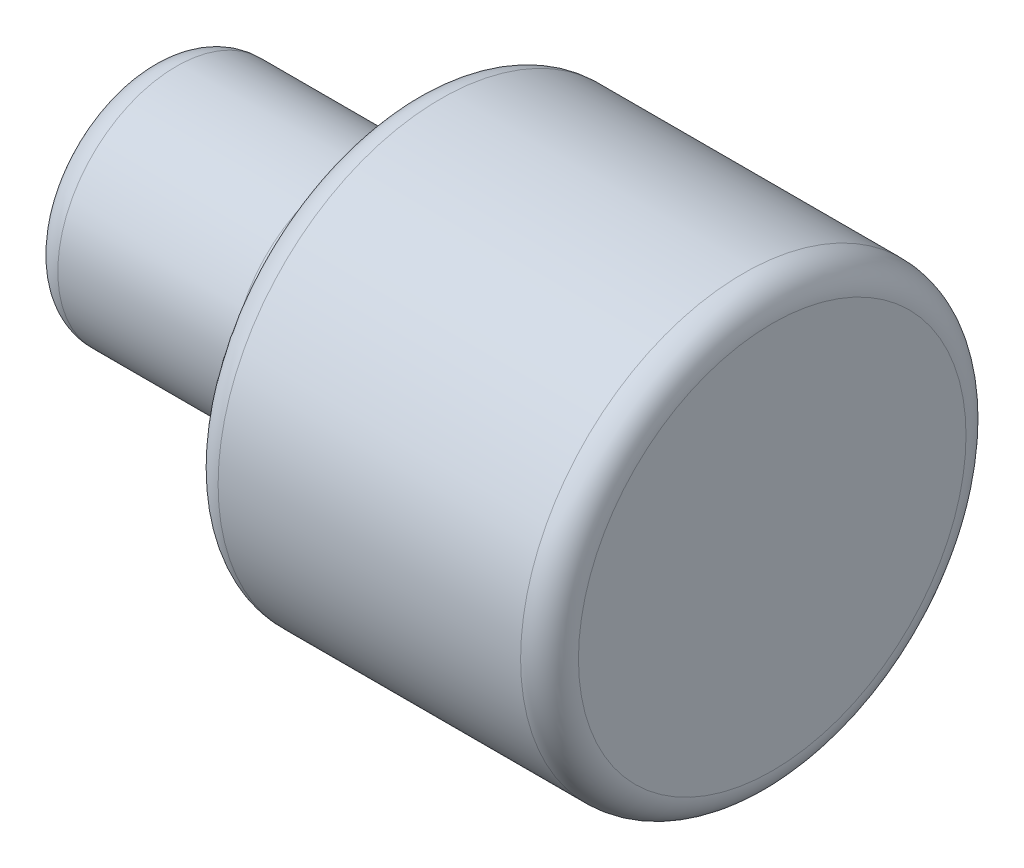
ISO-10303-21;
HEADER;
FILE_DESCRIPTION(('STEP AP214'),'2;1');
FILE_NAME('part.step','',(''),(''),'','','');
FILE_SCHEMA(('AUTOMOTIVE_DESIGN { 1 0 10303 214 1 1 1 1 }'));
ENDSEC;
DATA;
#1=APPLICATION_CONTEXT('core data for automotive mechanical design processes');
#2=APPLICATION_PROTOCOL_DEFINITION('international standard','automotive_design',2000,#1);
#3=PRODUCT_CONTEXT('',#1,'mechanical');
#4=PRODUCT('Part','Part','',(#3));
#5=PRODUCT_RELATED_PRODUCT_CATEGORY('part','',(#4));
#6=PRODUCT_DEFINITION_FORMATION('','',#4);
#7=PRODUCT_DEFINITION_CONTEXT('part definition',#1,'design');
#8=PRODUCT_DEFINITION('design','',#6,#7);
#9=PRODUCT_DEFINITION_SHAPE('','',#8);
#10=(LENGTH_UNIT() NAMED_UNIT(*) SI_UNIT(.MILLI.,.METRE.));
#11=(NAMED_UNIT(*) PLANE_ANGLE_UNIT() SI_UNIT($,.RADIAN.));
#12=(NAMED_UNIT(*) SI_UNIT($,.STERADIAN.) SOLID_ANGLE_UNIT());
#13=UNCERTAINTY_MEASURE_WITH_UNIT(LENGTH_MEASURE(1.E-05),#10,'distance_accuracy_value','');
#14=(GEOMETRIC_REPRESENTATION_CONTEXT(3) GLOBAL_UNCERTAINTY_ASSIGNED_CONTEXT((#13)) GLOBAL_UNIT_ASSIGNED_CONTEXT((#10,
#11,#12)) REPRESENTATION_CONTEXT('',''));
#15=CARTESIAN_POINT('',(0.,0.,0.));
#16=DIRECTION('',(0.,0.,1.));
#17=DIRECTION('',(1.,0.,0.));
#18=AXIS2_PLACEMENT_3D('',#15,#16,#17);
#19=CARTESIAN_POINT('',(6.,0.,0.));
#20=DIRECTION('',(-1.,0.,0.));
#21=DIRECTION('',(0.,0.,1.));
#22=AXIS2_PLACEMENT_3D('',#19,#20,#21);
#23=CYLINDRICAL_SURFACE('',#22,3.85);
#24=CARTESIAN_POINT('',(0.271074076886835,0.,0.));
#25=DIRECTION('',(-1.,0.,0.));
#26=DIRECTION('',(0.,0.,1.));
#27=AXIS2_PLACEMENT_3D('',#24,#25,#26);
#28=CIRCLE('',#27,3.85);
#29=CARTESIAN_POINT('',(0.271074076886835,0.,3.85));
#30=VERTEX_POINT('',#29);
#31=EDGE_CURVE('E79',#30,#30,#28,.F.);
#32=ORIENTED_EDGE('',*,*,#31,.T.);
#33=EDGE_LOOP('',(#32));
#34=FACE_BOUND('',#33,.T.);
#35=CARTESIAN_POINT('',(5.5,0.,0.));
#36=DIRECTION('',(1.,0.,0.));
#37=DIRECTION('',(0.,0.,-1.));
#38=AXIS2_PLACEMENT_3D('',#35,#36,#37);
#39=CIRCLE('',#38,3.85);
#40=CARTESIAN_POINT('',(5.5,0.,-3.85));
#41=VERTEX_POINT('',#40);
#42=EDGE_CURVE('E83',#41,#41,#39,.F.);
#43=ORIENTED_EDGE('',*,*,#42,.T.);
#44=EDGE_LOOP('',(#43));
#45=FACE_BOUND('',#44,.T.);
#46=ADVANCED_FACE('F47',(#34,#45),#23,.T.);
#47=CARTESIAN_POINT('',(6.,0.,0.));
#48=DIRECTION('',(1.,0.,0.));
#49=DIRECTION('',(0.,0.,-1.));
#50=AXIS2_PLACEMENT_3D('',#47,#48,#49);
#51=PLANE('',#50);
#52=CARTESIAN_POINT('',(6.,0.,0.));
#53=DIRECTION('',(1.,0.,0.));
#54=DIRECTION('',(0.,0.,-1.));
#55=AXIS2_PLACEMENT_3D('',#52,#53,#54);
#56=CIRCLE('',#55,3.35);
#57=CARTESIAN_POINT('',(6.,0.,-3.35));
#58=VERTEX_POINT('',#57);
#59=EDGE_CURVE('E65',#58,#58,#56,.T.);
#60=ORIENTED_EDGE('',*,*,#59,.T.);
#61=EDGE_LOOP('',(#60));
#62=FACE_BOUND('',#61,.T.);
#63=ADVANCED_FACE('F97',(#62),#51,.T.);
#64=CARTESIAN_POINT('',(-4.8,0.,0.));
#65=DIRECTION('',(1.,0.,0.));
#66=DIRECTION('',(0.,0.,-1.));
#67=AXIS2_PLACEMENT_3D('',#64,#65,#66);
#68=CYLINDRICAL_SURFACE('',#67,2.05);
#69=CARTESIAN_POINT('',(-4.3,0.,0.));
#70=DIRECTION('',(1.,0.,0.));
#71=DIRECTION('',(0.,0.,-1.));
#72=AXIS2_PLACEMENT_3D('',#69,#70,#71);
#73=CIRCLE('',#72,2.05);
#74=CARTESIAN_POINT('',(-4.3,0.,-2.05));
#75=VERTEX_POINT('',#74);
#76=EDGE_CURVE('E55',#75,#75,#73,.T.);
#77=ORIENTED_EDGE('',*,*,#76,.T.);
#78=EDGE_LOOP('',(#77));
#79=FACE_BOUND('',#78,.T.);
#80=CARTESIAN_POINT('',(-1.29810110391388,0.,0.));
#81=DIRECTION('',(-1.,0.,0.));
#82=DIRECTION('',(0.,0.,1.));
#83=AXIS2_PLACEMENT_3D('',#80,#81,#82);
#84=CIRCLE('',#83,2.05);
#85=CARTESIAN_POINT('',(-1.29810110391388,0.,2.05));
#86=VERTEX_POINT('',#85);
#87=EDGE_CURVE('E60',#86,#86,#84,.T.);
#88=ORIENTED_EDGE('',*,*,#87,.T.);
#89=EDGE_LOOP('',(#88));
#90=FACE_BOUND('',#89,.T.);
#91=ADVANCED_FACE('F99',(#79,#90),#68,.T.);
#92=CARTESIAN_POINT('',(-4.8,0.,0.));
#93=DIRECTION('',(1.,0.,0.));
#94=DIRECTION('',(0.,0.,-1.));
#95=AXIS2_PLACEMENT_3D('',#92,#93,#94);
#96=PLANE('',#95);
#97=CARTESIAN_POINT('',(-4.8,0.,0.));
#98=DIRECTION('',(1.,0.,0.));
#99=DIRECTION('',(0.,0.,-1.));
#100=AXIS2_PLACEMENT_3D('',#97,#98,#99);
#101=CIRCLE('',#100,1.55);
#102=CARTESIAN_POINT('',(-4.8,0.,-1.55));
#103=VERTEX_POINT('',#102);
#104=EDGE_CURVE('E10',#103,#103,#101,.F.);
#105=ORIENTED_EDGE('',*,*,#104,.T.);
#106=EDGE_LOOP('',(#105));
#107=FACE_BOUND('',#106,.T.);
#108=ADVANCED_FACE('F105',(#107),#96,.F.);
#109=CARTESIAN_POINT('',(0.,0.,0.));
#110=DIRECTION('',(1.,0.,0.));
#111=DIRECTION('',(0.,0.,-1.));
#112=AXIS2_PLACEMENT_3D('',#109,#110,#111);
#113=CONICAL_SURFACE('',#112,3.90000000000001,1.07524465330906);
#114=CARTESIAN_POINT('',(-0.168779179901228,0.,0.));
#115=DIRECTION('',(-1.,0.,0.));
#116=DIRECTION('',(0.,0.,1.));
#117=AXIS2_PLACEMENT_3D('',#114,#115,#116);
#118=CIRCLE('',#117,3.58775851718274);
#119=CARTESIAN_POINT('',(-0.168779179901228,0.,3.58775851718274));
#120=VERTEX_POINT('',#119);
#121=EDGE_CURVE('E71',#120,#120,#118,.T.);
#122=ORIENTED_EDGE('',*,*,#121,.T.);
#123=EDGE_LOOP('',(#122));
#124=FACE_BOUND('',#123,.T.);
#125=CARTESIAN_POINT('',(-0.858247847125816,0.,0.));
#126=DIRECTION('',(-1.,0.,0.));
#127=DIRECTION('',(0.,0.,1.));
#128=AXIS2_PLACEMENT_3D('',#125,#126,#127);
#129=CIRCLE('',#128,2.31224148281726);
#130=CARTESIAN_POINT('',(-0.858247847125816,0.,2.31224148281726));
#131=VERTEX_POINT('',#130);
#132=EDGE_CURVE('E75',#131,#131,#129,.F.);
#133=ORIENTED_EDGE('',*,*,#132,.T.);
#134=EDGE_LOOP('',(#133));
#135=FACE_BOUND('',#134,.T.);
#136=ADVANCED_FACE('F112',(#124,#135),#113,.T.);
#137=CARTESIAN_POINT('',(0.271074076886835,0.,0.));
#138=DIRECTION('',(-1.,0.,0.));
#139=DIRECTION('',(0.,0.,1.));
#140=AXIS2_PLACEMENT_3D('',#137,#138,#139);
#141=TOROIDAL_SURFACE('',#140,3.35,0.5);
#142=ORIENTED_EDGE('',*,*,#121,.F.);
#143=EDGE_LOOP('',(#142));
#144=FACE_BOUND('',#143,.T.);
#145=ORIENTED_EDGE('',*,*,#31,.F.);
#146=EDGE_LOOP('',(#145));
#147=FACE_BOUND('',#146,.T.);
#148=ADVANCED_FACE('F93',(#144,#147),#141,.T.);
#149=CARTESIAN_POINT('',(5.5,0.,0.));
#150=DIRECTION('',(1.,0.,0.));
#151=DIRECTION('',(0.,0.,-1.));
#152=AXIS2_PLACEMENT_3D('',#149,#150,#151);
#153=TOROIDAL_SURFACE('',#152,3.35,0.5);
#154=ORIENTED_EDGE('',*,*,#42,.F.);
#155=EDGE_LOOP('',(#154));
#156=FACE_BOUND('',#155,.T.);
#157=ORIENTED_EDGE('',*,*,#59,.F.);
#158=EDGE_LOOP('',(#157));
#159=FACE_BOUND('',#158,.T.);
#160=ADVANCED_FACE('F89',(#156,#159),#153,.T.);
#161=CARTESIAN_POINT('',(-4.3,0.,0.));
#162=DIRECTION('',(1.,0.,0.));
#163=DIRECTION('',(0.,0.,-1.));
#164=AXIS2_PLACEMENT_3D('',#161,#162,#163);
#165=TOROIDAL_SURFACE('',#164,1.55,0.5);
#166=ORIENTED_EDGE('',*,*,#104,.F.);
#167=EDGE_LOOP('',(#166));
#168=FACE_BOUND('',#167,.T.);
#169=ORIENTED_EDGE('',*,*,#76,.F.);
#170=EDGE_LOOP('',(#169));
#171=FACE_BOUND('',#170,.T.);
#172=ADVANCED_FACE('F92',(#168,#171),#165,.T.);
#173=CARTESIAN_POINT('',(-1.29810110391388,0.,0.));
#174=DIRECTION('',(-1.,0.,0.));
#175=DIRECTION('',(0.,0.,1.));
#176=AXIS2_PLACEMENT_3D('',#173,#174,#175);
#177=TOROIDAL_SURFACE('',#176,2.55,0.5);
#178=ORIENTED_EDGE('',*,*,#132,.F.);
#179=EDGE_LOOP('',(#178));
#180=FACE_BOUND('',#179,.T.);
#181=ORIENTED_EDGE('',*,*,#87,.F.);
#182=EDGE_LOOP('',(#181));
#183=FACE_BOUND('',#182,.T.);
#184=ADVANCED_FACE('F49',(#180,#183),#177,.F.);
#185=CLOSED_SHELL('',(#46,#63,#91,#108,#136,#148,#160,#172,#184));
#186=MANIFOLD_SOLID_BREP('B2',#185);
#187=ADVANCED_BREP_SHAPE_REPRESENTATION('',(#18,#186),#14);
#188=SHAPE_DEFINITION_REPRESENTATION(#9,#187);
ENDSEC;
END-ISO-10303-21;
